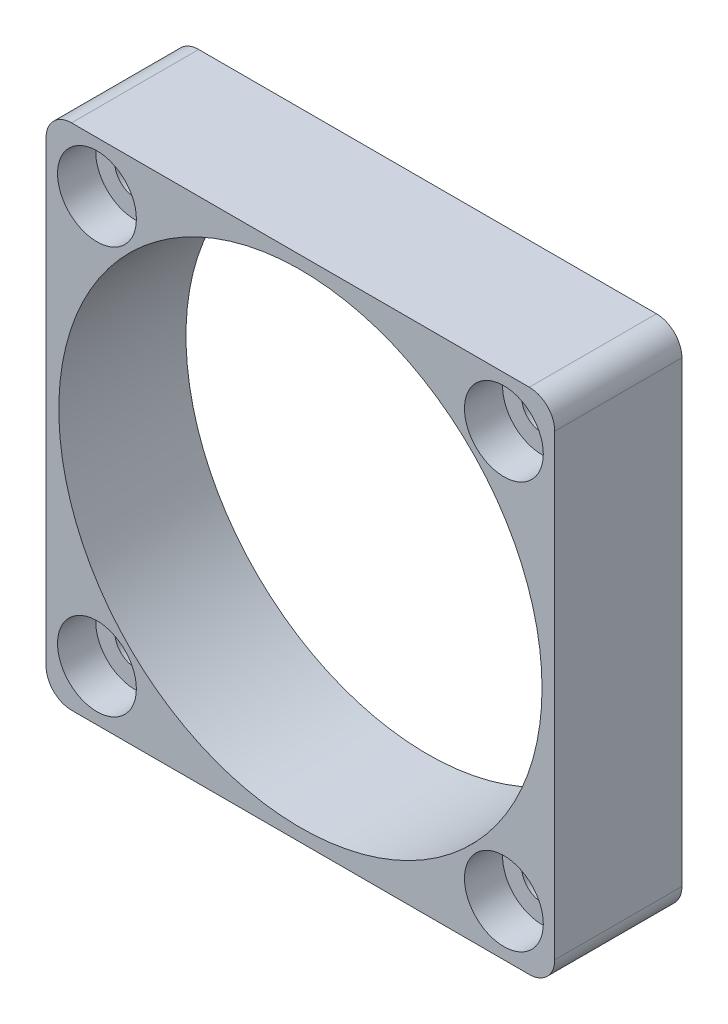
ISO-10303-21;
HEADER;
FILE_DESCRIPTION(('STEP AP214'),'2;1');
FILE_NAME('part.step','',(''),(''),'','','');
FILE_SCHEMA(('AUTOMOTIVE_DESIGN { 1 0 10303 214 1 1 1 1 }'));
ENDSEC;
DATA;
#1=APPLICATION_CONTEXT('core data for automotive mechanical design processes');
#2=APPLICATION_PROTOCOL_DEFINITION('international standard','automotive_design',2000,#1);
#3=PRODUCT_CONTEXT('',#1,'mechanical');
#4=PRODUCT('Part','Part','',(#3));
#5=PRODUCT_RELATED_PRODUCT_CATEGORY('part','',(#4));
#6=PRODUCT_DEFINITION_FORMATION('','',#4);
#7=PRODUCT_DEFINITION_CONTEXT('part definition',#1,'design');
#8=PRODUCT_DEFINITION('design','',#6,#7);
#9=PRODUCT_DEFINITION_SHAPE('','',#8);
#10=(LENGTH_UNIT() NAMED_UNIT(*) SI_UNIT(.MILLI.,.METRE.));
#11=(NAMED_UNIT(*) PLANE_ANGLE_UNIT() SI_UNIT($,.RADIAN.));
#12=(NAMED_UNIT(*) SI_UNIT($,.STERADIAN.) SOLID_ANGLE_UNIT());
#13=UNCERTAINTY_MEASURE_WITH_UNIT(LENGTH_MEASURE(1.E-05),#10,'distance_accuracy_value','');
#14=(GEOMETRIC_REPRESENTATION_CONTEXT(3) GLOBAL_UNCERTAINTY_ASSIGNED_CONTEXT((#13)) GLOBAL_UNIT_ASSIGNED_CONTEXT((#10,
#11,#12)) REPRESENTATION_CONTEXT('',''));
#15=CARTESIAN_POINT('',(0.,0.,0.));
#16=DIRECTION('',(0.,0.,1.));
#17=DIRECTION('',(1.,0.,0.));
#18=AXIS2_PLACEMENT_3D('',#15,#16,#17);
#19=CARTESIAN_POINT('',(-16.,16.,0.));
#20=DIRECTION('',(0.,0.,1.));
#21=DIRECTION('',(1.,0.,0.));
#22=AXIS2_PLACEMENT_3D('',#19,#20,#21);
#23=CYLINDRICAL_SURFACE('',#22,1.6);
#24=CARTESIAN_POINT('',(-16.,16.,0.));
#25=DIRECTION('',(0.,0.,1.));
#26=DIRECTION('',(1.,0.,0.));
#27=AXIS2_PLACEMENT_3D('',#24,#25,#26);
#28=CIRCLE('',#27,1.6);
#29=CARTESIAN_POINT('',(-14.4,16.,0.));
#30=VERTEX_POINT('',#29);
#31=EDGE_CURVE('E200',#30,#30,#28,.T.);
#32=ORIENTED_EDGE('',*,*,#31,.F.);
#33=EDGE_LOOP('',(#32));
#34=FACE_BOUND('',#33,.T.);
#35=CARTESIAN_POINT('',(-16.,16.,7.));
#36=DIRECTION('',(0.,0.,1.));
#37=DIRECTION('',(1.,0.,0.));
#38=AXIS2_PLACEMENT_3D('',#35,#36,#37);
#39=CIRCLE('',#38,1.6);
#40=CARTESIAN_POINT('',(-14.4,16.,7.));
#41=VERTEX_POINT('',#40);
#42=EDGE_CURVE('E38',#41,#41,#39,.F.);
#43=ORIENTED_EDGE('',*,*,#42,.F.);
#44=EDGE_LOOP('',(#43));
#45=FACE_BOUND('',#44,.T.);
#46=ADVANCED_FACE('F34',(#34,#45),#23,.F.);
#47=CARTESIAN_POINT('',(16.,16.,0.));
#48=DIRECTION('',(0.,0.,1.));
#49=DIRECTION('',(1.,0.,0.));
#50=AXIS2_PLACEMENT_3D('',#47,#48,#49);
#51=CYLINDRICAL_SURFACE('',#50,1.6);
#52=CARTESIAN_POINT('',(16.,16.,0.));
#53=DIRECTION('',(0.,0.,1.));
#54=DIRECTION('',(1.,0.,0.));
#55=AXIS2_PLACEMENT_3D('',#52,#53,#54);
#56=CIRCLE('',#55,1.6);
#57=CARTESIAN_POINT('',(17.6,16.,0.));
#58=VERTEX_POINT('',#57);
#59=EDGE_CURVE('E197',#58,#58,#56,.T.);
#60=ORIENTED_EDGE('',*,*,#59,.F.);
#61=EDGE_LOOP('',(#60));
#62=FACE_BOUND('',#61,.T.);
#63=CARTESIAN_POINT('',(16.,16.,7.));
#64=DIRECTION('',(0.,0.,1.));
#65=DIRECTION('',(1.,0.,0.));
#66=AXIS2_PLACEMENT_3D('',#63,#64,#65);
#67=CIRCLE('',#66,1.6);
#68=CARTESIAN_POINT('',(17.6,16.,7.));
#69=VERTEX_POINT('',#68);
#70=EDGE_CURVE('E167',#69,#69,#67,.F.);
#71=ORIENTED_EDGE('',*,*,#70,.F.);
#72=EDGE_LOOP('',(#71));
#73=FACE_BOUND('',#72,.T.);
#74=ADVANCED_FACE('F237',(#62,#73),#51,.F.);
#75=CARTESIAN_POINT('',(16.,-16.,0.));
#76=DIRECTION('',(0.,0.,1.));
#77=DIRECTION('',(1.,0.,0.));
#78=AXIS2_PLACEMENT_3D('',#75,#76,#77);
#79=CYLINDRICAL_SURFACE('',#78,1.6);
#80=CARTESIAN_POINT('',(16.,-16.,0.));
#81=DIRECTION('',(0.,0.,1.));
#82=DIRECTION('',(1.,0.,0.));
#83=AXIS2_PLACEMENT_3D('',#80,#81,#82);
#84=CIRCLE('',#83,1.6);
#85=CARTESIAN_POINT('',(17.6,-16.,0.));
#86=VERTEX_POINT('',#85);
#87=EDGE_CURVE('E194',#86,#86,#84,.T.);
#88=ORIENTED_EDGE('',*,*,#87,.F.);
#89=EDGE_LOOP('',(#88));
#90=FACE_BOUND('',#89,.T.);
#91=CARTESIAN_POINT('',(16.,-16.,7.));
#92=DIRECTION('',(0.,0.,1.));
#93=DIRECTION('',(1.,0.,0.));
#94=AXIS2_PLACEMENT_3D('',#91,#92,#93);
#95=CIRCLE('',#94,1.6);
#96=CARTESIAN_POINT('',(17.6,-16.,7.));
#97=VERTEX_POINT('',#96);
#98=EDGE_CURVE('E163',#97,#97,#95,.F.);
#99=ORIENTED_EDGE('',*,*,#98,.F.);
#100=EDGE_LOOP('',(#99));
#101=FACE_BOUND('',#100,.T.);
#102=ADVANCED_FACE('F243',(#90,#101),#79,.F.);
#103=CARTESIAN_POINT('',(-16.,-16.,0.));
#104=DIRECTION('',(0.,0.,1.));
#105=DIRECTION('',(1.,0.,0.));
#106=AXIS2_PLACEMENT_3D('',#103,#104,#105);
#107=CYLINDRICAL_SURFACE('',#106,1.6);
#108=CARTESIAN_POINT('',(-16.,-16.,0.));
#109=DIRECTION('',(0.,0.,1.));
#110=DIRECTION('',(1.,0.,0.));
#111=AXIS2_PLACEMENT_3D('',#108,#109,#110);
#112=CIRCLE('',#111,1.6);
#113=CARTESIAN_POINT('',(-14.4,-16.,0.));
#114=VERTEX_POINT('',#113);
#115=EDGE_CURVE('E161',#114,#114,#112,.T.);
#116=ORIENTED_EDGE('',*,*,#115,.F.);
#117=EDGE_LOOP('',(#116));
#118=FACE_BOUND('',#117,.T.);
#119=CARTESIAN_POINT('',(-16.,-16.,7.));
#120=DIRECTION('',(0.,0.,1.));
#121=DIRECTION('',(1.,0.,0.));
#122=AXIS2_PLACEMENT_3D('',#119,#120,#121);
#123=CIRCLE('',#122,1.6);
#124=CARTESIAN_POINT('',(-14.4,-16.,7.));
#125=VERTEX_POINT('',#124);
#126=EDGE_CURVE('E158',#125,#125,#123,.F.);
#127=ORIENTED_EDGE('',*,*,#126,.F.);
#128=EDGE_LOOP('',(#127));
#129=FACE_BOUND('',#128,.T.);
#130=ADVANCED_FACE('F276',(#118,#129),#107,.F.);
#131=CARTESIAN_POINT('',(20.,20.,10.));
#132=DIRECTION('',(-1.,0.,0.));
#133=DIRECTION('',(0.,0.,1.));
#134=AXIS2_PLACEMENT_3D('',#131,#132,#133);
#135=PLANE('',#134);
#136=DIRECTION('',(0.,1.,0.));
#137=VECTOR('',#136,1.);
#138=CARTESIAN_POINT('',(20.,20.,10.));
#139=LINE('',#138,#137);
#140=CARTESIAN_POINT('',(20.,-18.,10.));
#141=VERTEX_POINT('',#140);
#142=CARTESIAN_POINT('',(20.,18.,10.));
#143=VERTEX_POINT('',#142);
#144=EDGE_CURVE('E130',#141,#143,#139,.T.);
#145=ORIENTED_EDGE('',*,*,#144,.F.);
#146=DIRECTION('',(0.,0.,-1.));
#147=VECTOR('',#146,1.);
#148=CARTESIAN_POINT('',(20.,-18.,10.));
#149=LINE('',#148,#147);
#150=CARTESIAN_POINT('',(20.,-18.,0.));
#151=VERTEX_POINT('',#150);
#152=EDGE_CURVE('E11',#141,#151,#149,.T.);
#153=ORIENTED_EDGE('',*,*,#152,.T.);
#154=DIRECTION('',(0.,1.,0.));
#155=VECTOR('',#154,1.);
#156=CARTESIAN_POINT('',(20.,20.,0.));
#157=LINE('',#156,#155);
#158=CARTESIAN_POINT('',(20.,18.,0.));
#159=VERTEX_POINT('',#158);
#160=EDGE_CURVE('E207',#151,#159,#157,.T.);
#161=ORIENTED_EDGE('',*,*,#160,.T.);
#162=DIRECTION('',(0.,0.,-1.));
#163=VECTOR('',#162,1.);
#164=CARTESIAN_POINT('',(20.,18.,10.));
#165=LINE('',#164,#163);
#166=EDGE_CURVE('E43',#159,#143,#165,.F.);
#167=ORIENTED_EDGE('',*,*,#166,.T.);
#168=EDGE_LOOP('',(#145,#153,#161,#167));
#169=FACE_BOUND('',#168,.T.);
#170=ADVANCED_FACE('F234',(#169),#135,.F.);
#171=CARTESIAN_POINT('',(-20.,20.,10.));
#172=DIRECTION('',(0.,-1.,0.));
#173=DIRECTION('',(0.,0.,-1.));
#174=AXIS2_PLACEMENT_3D('',#171,#172,#173);
#175=PLANE('',#174);
#176=DIRECTION('',(-1.,0.,0.));
#177=VECTOR('',#176,1.);
#178=CARTESIAN_POINT('',(-20.,20.,0.));
#179=LINE('',#178,#177);
#180=CARTESIAN_POINT('',(18.,20.,0.));
#181=VERTEX_POINT('',#180);
#182=CARTESIAN_POINT('',(-18.,20.,0.));
#183=VERTEX_POINT('',#182);
#184=EDGE_CURVE('E135',#181,#183,#179,.T.);
#185=ORIENTED_EDGE('',*,*,#184,.T.);
#186=DIRECTION('',(0.,0.,-1.));
#187=VECTOR('',#186,1.);
#188=CARTESIAN_POINT('',(-18.,20.,10.));
#189=LINE('',#188,#187);
#190=CARTESIAN_POINT('',(-18.,20.,10.));
#191=VERTEX_POINT('',#190);
#192=EDGE_CURVE('E51',#183,#191,#189,.F.);
#193=ORIENTED_EDGE('',*,*,#192,.T.);
#194=DIRECTION('',(-1.,0.,0.));
#195=VECTOR('',#194,1.);
#196=CARTESIAN_POINT('',(-20.,20.,10.));
#197=LINE('',#196,#195);
#198=CARTESIAN_POINT('',(18.,20.,10.));
#199=VERTEX_POINT('',#198);
#200=EDGE_CURVE('E133',#199,#191,#197,.T.);
#201=ORIENTED_EDGE('',*,*,#200,.F.);
#202=DIRECTION('',(0.,0.,-1.));
#203=VECTOR('',#202,1.);
#204=CARTESIAN_POINT('',(18.,20.,10.));
#205=LINE('',#204,#203);
#206=EDGE_CURVE('E153',#199,#181,#205,.T.);
#207=ORIENTED_EDGE('',*,*,#206,.T.);
#208=EDGE_LOOP('',(#185,#193,#201,#207));
#209=FACE_BOUND('',#208,.T.);
#210=ADVANCED_FACE('F217',(#209),#175,.F.);
#211=CARTESIAN_POINT('',(-20.,20.,10.));
#212=DIRECTION('',(1.,0.,0.));
#213=DIRECTION('',(0.,1.,0.));
#214=AXIS2_PLACEMENT_3D('',#211,#212,#213);
#215=PLANE('',#214);
#216=DIRECTION('',(0.,-1.,0.));
#217=VECTOR('',#216,1.);
#218=CARTESIAN_POINT('',(-20.,20.,0.));
#219=LINE('',#218,#217);
#220=CARTESIAN_POINT('',(-20.,18.,0.));
#221=VERTEX_POINT('',#220);
#222=CARTESIAN_POINT('',(-20.,-18.,0.));
#223=VERTEX_POINT('',#222);
#224=EDGE_CURVE('E131',#221,#223,#219,.T.);
#225=ORIENTED_EDGE('',*,*,#224,.T.);
#226=DIRECTION('',(0.,0.,-1.));
#227=VECTOR('',#226,1.);
#228=CARTESIAN_POINT('',(-20.,-18.,10.));
#229=LINE('',#228,#227);
#230=CARTESIAN_POINT('',(-20.,-18.,10.));
#231=VERTEX_POINT('',#230);
#232=EDGE_CURVE('E108',#223,#231,#229,.F.);
#233=ORIENTED_EDGE('',*,*,#232,.T.);
#234=DIRECTION('',(0.,-1.,0.));
#235=VECTOR('',#234,1.);
#236=CARTESIAN_POINT('',(-20.,20.,10.));
#237=LINE('',#236,#235);
#238=CARTESIAN_POINT('',(-20.,18.,10.));
#239=VERTEX_POINT('',#238);
#240=EDGE_CURVE('E211',#239,#231,#237,.T.);
#241=ORIENTED_EDGE('',*,*,#240,.F.);
#242=DIRECTION('',(0.,0.,-1.));
#243=VECTOR('',#242,1.);
#244=CARTESIAN_POINT('',(-20.,18.,10.));
#245=LINE('',#244,#243);
#246=EDGE_CURVE('E113',#239,#221,#245,.T.);
#247=ORIENTED_EDGE('',*,*,#246,.T.);
#248=EDGE_LOOP('',(#225,#233,#241,#247));
#249=FACE_BOUND('',#248,.T.);
#250=ADVANCED_FACE('F226',(#249),#215,.F.);
#251=CARTESIAN_POINT('',(-20.,-20.,10.));
#252=DIRECTION('',(0.,1.,0.));
#253=DIRECTION('',(0.,0.,1.));
#254=AXIS2_PLACEMENT_3D('',#251,#252,#253);
#255=PLANE('',#254);
#256=DIRECTION('',(1.,0.,0.));
#257=VECTOR('',#256,1.);
#258=CARTESIAN_POINT('',(-20.,-20.,10.));
#259=LINE('',#258,#257);
#260=CARTESIAN_POINT('',(-18.,-20.,10.));
#261=VERTEX_POINT('',#260);
#262=CARTESIAN_POINT('',(18.,-20.,10.));
#263=VERTEX_POINT('',#262);
#264=EDGE_CURVE('E123',#261,#263,#259,.T.);
#265=ORIENTED_EDGE('',*,*,#264,.F.);
#266=DIRECTION('',(0.,0.,-1.));
#267=VECTOR('',#266,1.);
#268=CARTESIAN_POINT('',(-18.,-20.,10.));
#269=LINE('',#268,#267);
#270=CARTESIAN_POINT('',(-18.,-20.,0.));
#271=VERTEX_POINT('',#270);
#272=EDGE_CURVE('E107',#261,#271,#269,.T.);
#273=ORIENTED_EDGE('',*,*,#272,.T.);
#274=DIRECTION('',(1.,0.,0.));
#275=VECTOR('',#274,1.);
#276=CARTESIAN_POINT('',(-20.,-20.,0.));
#277=LINE('',#276,#275);
#278=CARTESIAN_POINT('',(18.,-20.,0.));
#279=VERTEX_POINT('',#278);
#280=EDGE_CURVE('E120',#271,#279,#277,.T.);
#281=ORIENTED_EDGE('',*,*,#280,.T.);
#282=DIRECTION('',(0.,0.,-1.));
#283=VECTOR('',#282,1.);
#284=CARTESIAN_POINT('',(18.,-20.,10.));
#285=LINE('',#284,#283);
#286=EDGE_CURVE('E125',#279,#263,#285,.F.);
#287=ORIENTED_EDGE('',*,*,#286,.T.);
#288=EDGE_LOOP('',(#265,#273,#281,#287));
#289=FACE_BOUND('',#288,.T.);
#290=ADVANCED_FACE('F119',(#289),#255,.F.);
#291=CARTESIAN_POINT('',(0.,0.,10.));
#292=DIRECTION('',(0.,0.,1.));
#293=DIRECTION('',(1.,0.,0.));
#294=AXIS2_PLACEMENT_3D('',#291,#292,#293);
#295=PLANE('',#294);
#296=CARTESIAN_POINT('',(-16.,16.,10.));
#297=DIRECTION('',(0.,0.,1.));
#298=DIRECTION('',(1.,0.,0.));
#299=AXIS2_PLACEMENT_3D('',#296,#297,#298);
#300=CIRCLE('',#299,3.1);
#301=CARTESIAN_POINT('',(-12.9,16.,10.));
#302=VERTEX_POINT('',#301);
#303=EDGE_CURVE('E183',#302,#302,#300,.T.);
#304=ORIENTED_EDGE('',*,*,#303,.F.);
#305=EDGE_LOOP('',(#304));
#306=FACE_BOUND('',#305,.T.);
#307=CARTESIAN_POINT('',(16.,16.,10.));
#308=DIRECTION('',(0.,0.,1.));
#309=DIRECTION('',(1.,0.,0.));
#310=AXIS2_PLACEMENT_3D('',#307,#308,#309);
#311=CIRCLE('',#310,3.1);
#312=CARTESIAN_POINT('',(19.1,16.,10.));
#313=VERTEX_POINT('',#312);
#314=EDGE_CURVE('E176',#313,#313,#311,.T.);
#315=ORIENTED_EDGE('',*,*,#314,.F.);
#316=EDGE_LOOP('',(#315));
#317=FACE_BOUND('',#316,.T.);
#318=CARTESIAN_POINT('',(16.,-16.,10.));
#319=DIRECTION('',(0.,0.,1.));
#320=DIRECTION('',(1.,0.,0.));
#321=AXIS2_PLACEMENT_3D('',#318,#319,#320);
#322=CIRCLE('',#321,3.1);
#323=CARTESIAN_POINT('',(19.1,-16.,10.));
#324=VERTEX_POINT('',#323);
#325=EDGE_CURVE('E169',#324,#324,#322,.T.);
#326=ORIENTED_EDGE('',*,*,#325,.F.);
#327=EDGE_LOOP('',(#326));
#328=FACE_BOUND('',#327,.T.);
#329=CARTESIAN_POINT('',(-16.,-16.,10.));
#330=DIRECTION('',(0.,0.,1.));
#331=DIRECTION('',(1.,0.,0.));
#332=AXIS2_PLACEMENT_3D('',#329,#330,#331);
#333=CIRCLE('',#332,3.1);
#334=CARTESIAN_POINT('',(-12.9,-16.,10.));
#335=VERTEX_POINT('',#334);
#336=EDGE_CURVE('E165',#335,#335,#333,.T.);
#337=ORIENTED_EDGE('',*,*,#336,.F.);
#338=EDGE_LOOP('',(#337));
#339=FACE_BOUND('',#338,.T.);
#340=CARTESIAN_POINT('',(0.,0.,10.));
#341=DIRECTION('',(0.,0.,1.));
#342=DIRECTION('',(1.,0.,0.));
#343=AXIS2_PLACEMENT_3D('',#340,#341,#342);
#344=CIRCLE('',#343,19.);
#345=CARTESIAN_POINT('',(19.,0.,10.));
#346=VERTEX_POINT('',#345);
#347=EDGE_CURVE('E203',#346,#346,#344,.T.);
#348=ORIENTED_EDGE('',*,*,#347,.F.);
#349=EDGE_LOOP('',(#348));
#350=FACE_BOUND('',#349,.T.);
#351=ORIENTED_EDGE('',*,*,#240,.T.);
#352=CARTESIAN_POINT('',(-18.,-18.,10.));
#353=DIRECTION('',(0.,0.,1.));
#354=DIRECTION('',(1.,0.,0.));
#355=AXIS2_PLACEMENT_3D('',#352,#353,#354);
#356=CIRCLE('',#355,2.);
#357=EDGE_CURVE('E151',#231,#261,#356,.T.);
#358=ORIENTED_EDGE('',*,*,#357,.T.);
#359=ORIENTED_EDGE('',*,*,#264,.T.);
#360=CARTESIAN_POINT('',(18.,-18.,10.));
#361=DIRECTION('',(0.,0.,1.));
#362=DIRECTION('',(1.,0.,0.));
#363=AXIS2_PLACEMENT_3D('',#360,#361,#362);
#364=CIRCLE('',#363,2.);
#365=EDGE_CURVE('E147',#263,#141,#364,.T.);
#366=ORIENTED_EDGE('',*,*,#365,.T.);
#367=ORIENTED_EDGE('',*,*,#144,.T.);
#368=CARTESIAN_POINT('',(18.,18.,10.));
#369=DIRECTION('',(0.,0.,1.));
#370=DIRECTION('',(1.,0.,0.));
#371=AXIS2_PLACEMENT_3D('',#368,#369,#370);
#372=CIRCLE('',#371,2.);
#373=EDGE_CURVE('E58',#143,#199,#372,.T.);
#374=ORIENTED_EDGE('',*,*,#373,.T.);
#375=ORIENTED_EDGE('',*,*,#200,.T.);
#376=CARTESIAN_POINT('',(-18.,18.,10.));
#377=DIRECTION('',(0.,0.,1.));
#378=DIRECTION('',(1.,0.,0.));
#379=AXIS2_PLACEMENT_3D('',#376,#377,#378);
#380=CIRCLE('',#379,2.);
#381=EDGE_CURVE('E149',#191,#239,#380,.T.);
#382=ORIENTED_EDGE('',*,*,#381,.T.);
#383=EDGE_LOOP('',(#351,#358,#359,#366,#367,#374,#375,#382));
#384=FACE_BOUND('',#383,.T.);
#385=ADVANCED_FACE('F224',(#306,#317,#328,#339,#350,#384),#295,.T.);
#386=CARTESIAN_POINT('',(0.,0.,0.));
#387=DIRECTION('',(0.,0.,1.));
#388=DIRECTION('',(1.,0.,0.));
#389=AXIS2_PLACEMENT_3D('',#386,#387,#388);
#390=PLANE('',#389);
#391=ORIENTED_EDGE('',*,*,#115,.T.);
#392=EDGE_LOOP('',(#391));
#393=FACE_BOUND('',#392,.T.);
#394=ORIENTED_EDGE('',*,*,#87,.T.);
#395=EDGE_LOOP('',(#394));
#396=FACE_BOUND('',#395,.T.);
#397=ORIENTED_EDGE('',*,*,#59,.T.);
#398=EDGE_LOOP('',(#397));
#399=FACE_BOUND('',#398,.T.);
#400=ORIENTED_EDGE('',*,*,#31,.T.);
#401=EDGE_LOOP('',(#400));
#402=FACE_BOUND('',#401,.T.);
#403=CARTESIAN_POINT('',(0.,0.,0.));
#404=DIRECTION('',(0.,0.,1.));
#405=DIRECTION('',(1.,0.,0.));
#406=AXIS2_PLACEMENT_3D('',#403,#404,#405);
#407=CIRCLE('',#406,19.);
#408=CARTESIAN_POINT('',(19.,0.,0.));
#409=VERTEX_POINT('',#408);
#410=EDGE_CURVE('E204',#409,#409,#407,.T.);
#411=ORIENTED_EDGE('',*,*,#410,.T.);
#412=EDGE_LOOP('',(#411));
#413=FACE_BOUND('',#412,.T.);
#414=ORIENTED_EDGE('',*,*,#280,.F.);
#415=CARTESIAN_POINT('',(-18.,-18.,0.));
#416=DIRECTION('',(0.,0.,1.));
#417=DIRECTION('',(1.,0.,0.));
#418=AXIS2_PLACEMENT_3D('',#415,#416,#417);
#419=CIRCLE('',#418,2.);
#420=EDGE_CURVE('E103',#271,#223,#419,.F.);
#421=ORIENTED_EDGE('',*,*,#420,.T.);
#422=ORIENTED_EDGE('',*,*,#224,.F.);
#423=CARTESIAN_POINT('',(-18.,18.,0.));
#424=DIRECTION('',(0.,0.,1.));
#425=DIRECTION('',(1.,0.,0.));
#426=AXIS2_PLACEMENT_3D('',#423,#424,#425);
#427=CIRCLE('',#426,2.);
#428=EDGE_CURVE('E114',#221,#183,#427,.F.);
#429=ORIENTED_EDGE('',*,*,#428,.T.);
#430=ORIENTED_EDGE('',*,*,#184,.F.);
#431=CARTESIAN_POINT('',(18.,18.,0.));
#432=DIRECTION('',(0.,0.,1.));
#433=DIRECTION('',(1.,0.,0.));
#434=AXIS2_PLACEMENT_3D('',#431,#432,#433);
#435=CIRCLE('',#434,2.);
#436=EDGE_CURVE('E124',#181,#159,#435,.F.);
#437=ORIENTED_EDGE('',*,*,#436,.T.);
#438=ORIENTED_EDGE('',*,*,#160,.F.);
#439=CARTESIAN_POINT('',(18.,-18.,0.));
#440=DIRECTION('',(0.,0.,1.));
#441=DIRECTION('',(1.,0.,0.));
#442=AXIS2_PLACEMENT_3D('',#439,#440,#441);
#443=CIRCLE('',#442,2.);
#444=EDGE_CURVE('E129',#151,#279,#443,.F.);
#445=ORIENTED_EDGE('',*,*,#444,.T.);
#446=EDGE_LOOP('',(#414,#421,#422,#429,#430,#437,#438,#445));
#447=FACE_BOUND('',#446,.T.);
#448=ADVANCED_FACE('F127',(#393,#396,#399,#402,#413,#447),#390,.F.);
#449=CARTESIAN_POINT('',(0.,0.,0.));
#450=DIRECTION('',(0.,0.,1.));
#451=DIRECTION('',(1.,0.,0.));
#452=AXIS2_PLACEMENT_3D('',#449,#450,#451);
#453=CYLINDRICAL_SURFACE('',#452,19.);
#454=ORIENTED_EDGE('',*,*,#410,.F.);
#455=EDGE_LOOP('',(#454));
#456=FACE_BOUND('',#455,.T.);
#457=ORIENTED_EDGE('',*,*,#347,.T.);
#458=EDGE_LOOP('',(#457));
#459=FACE_BOUND('',#458,.T.);
#460=ADVANCED_FACE('F250',(#456,#459),#453,.F.);
#461=CARTESIAN_POINT('',(-18.,-18.,10.));
#462=DIRECTION('',(0.,0.,-1.));
#463=DIRECTION('',(-1.,0.,0.));
#464=AXIS2_PLACEMENT_3D('',#461,#462,#463);
#465=CYLINDRICAL_SURFACE('',#464,2.);
#466=ORIENTED_EDGE('',*,*,#357,.F.);
#467=ORIENTED_EDGE('',*,*,#232,.F.);
#468=ORIENTED_EDGE('',*,*,#420,.F.);
#469=ORIENTED_EDGE('',*,*,#272,.F.);
#470=EDGE_LOOP('',(#466,#467,#468,#469));
#471=FACE_BOUND('',#470,.T.);
#472=ADVANCED_FACE('F106',(#471),#465,.T.);
#473=CARTESIAN_POINT('',(-18.,18.,10.));
#474=DIRECTION('',(0.,0.,-1.));
#475=DIRECTION('',(-1.,0.,0.));
#476=AXIS2_PLACEMENT_3D('',#473,#474,#475);
#477=CYLINDRICAL_SURFACE('',#476,2.);
#478=ORIENTED_EDGE('',*,*,#381,.F.);
#479=ORIENTED_EDGE('',*,*,#192,.F.);
#480=ORIENTED_EDGE('',*,*,#428,.F.);
#481=ORIENTED_EDGE('',*,*,#246,.F.);
#482=EDGE_LOOP('',(#478,#479,#480,#481));
#483=FACE_BOUND('',#482,.T.);
#484=ADVANCED_FACE('F221',(#483),#477,.T.);
#485=CARTESIAN_POINT('',(18.,-18.,10.));
#486=DIRECTION('',(0.,0.,-1.));
#487=DIRECTION('',(-1.,0.,0.));
#488=AXIS2_PLACEMENT_3D('',#485,#486,#487);
#489=CYLINDRICAL_SURFACE('',#488,2.);
#490=ORIENTED_EDGE('',*,*,#365,.F.);
#491=ORIENTED_EDGE('',*,*,#286,.F.);
#492=ORIENTED_EDGE('',*,*,#444,.F.);
#493=ORIENTED_EDGE('',*,*,#152,.F.);
#494=EDGE_LOOP('',(#490,#491,#492,#493));
#495=FACE_BOUND('',#494,.T.);
#496=ADVANCED_FACE('F319',(#495),#489,.T.);
#497=CARTESIAN_POINT('',(18.,18.,10.));
#498=DIRECTION('',(0.,0.,-1.));
#499=DIRECTION('',(-1.,0.,0.));
#500=AXIS2_PLACEMENT_3D('',#497,#498,#499);
#501=CYLINDRICAL_SURFACE('',#500,2.);
#502=ORIENTED_EDGE('',*,*,#373,.F.);
#503=ORIENTED_EDGE('',*,*,#166,.F.);
#504=ORIENTED_EDGE('',*,*,#436,.F.);
#505=ORIENTED_EDGE('',*,*,#206,.F.);
#506=EDGE_LOOP('',(#502,#503,#504,#505));
#507=FACE_BOUND('',#506,.T.);
#508=ADVANCED_FACE('F36',(#507),#501,.T.);
#509=CARTESIAN_POINT('',(-16.,-16.,7.));
#510=DIRECTION('',(0.,0.,1.));
#511=DIRECTION('',(1.,0.,0.));
#512=AXIS2_PLACEMENT_3D('',#509,#510,#511);
#513=PLANE('',#512);
#514=CARTESIAN_POINT('',(-16.,-16.,7.));
#515=DIRECTION('',(0.,0.,1.));
#516=DIRECTION('',(1.,0.,0.));
#517=AXIS2_PLACEMENT_3D('',#514,#515,#516);
#518=CIRCLE('',#517,3.1);
#519=CARTESIAN_POINT('',(-12.9,-16.,7.));
#520=VERTEX_POINT('',#519);
#521=EDGE_CURVE('E162',#520,#520,#518,.T.);
#522=ORIENTED_EDGE('',*,*,#521,.T.);
#523=EDGE_LOOP('',(#522));
#524=FACE_BOUND('',#523,.T.);
#525=ORIENTED_EDGE('',*,*,#126,.T.);
#526=EDGE_LOOP('',(#525));
#527=FACE_BOUND('',#526,.T.);
#528=ADVANCED_FACE('F292',(#524,#527),#513,.T.);
#529=CARTESIAN_POINT('',(-16.,-16.,7.));
#530=DIRECTION('',(0.,0.,1.));
#531=DIRECTION('',(1.,0.,0.));
#532=AXIS2_PLACEMENT_3D('',#529,#530,#531);
#533=CYLINDRICAL_SURFACE('',#532,3.1);
#534=ORIENTED_EDGE('',*,*,#521,.F.);
#535=EDGE_LOOP('',(#534));
#536=FACE_BOUND('',#535,.T.);
#537=ORIENTED_EDGE('',*,*,#336,.T.);
#538=EDGE_LOOP('',(#537));
#539=FACE_BOUND('',#538,.T.);
#540=ADVANCED_FACE('F282',(#536,#539),#533,.F.);
#541=CARTESIAN_POINT('',(16.,-16.,7.));
#542=DIRECTION('',(0.,0.,1.));
#543=DIRECTION('',(1.,0.,0.));
#544=AXIS2_PLACEMENT_3D('',#541,#542,#543);
#545=PLANE('',#544);
#546=CARTESIAN_POINT('',(16.,-16.,7.));
#547=DIRECTION('',(0.,0.,1.));
#548=DIRECTION('',(1.,0.,0.));
#549=AXIS2_PLACEMENT_3D('',#546,#547,#548);
#550=CIRCLE('',#549,3.1);
#551=CARTESIAN_POINT('',(19.1,-16.,7.));
#552=VERTEX_POINT('',#551);
#553=EDGE_CURVE('E166',#552,#552,#550,.T.);
#554=ORIENTED_EDGE('',*,*,#553,.T.);
#555=EDGE_LOOP('',(#554));
#556=FACE_BOUND('',#555,.T.);
#557=ORIENTED_EDGE('',*,*,#98,.T.);
#558=EDGE_LOOP('',(#557));
#559=FACE_BOUND('',#558,.T.);
#560=ADVANCED_FACE('F279',(#556,#559),#545,.T.);
#561=CARTESIAN_POINT('',(16.,-16.,7.));
#562=DIRECTION('',(0.,0.,1.));
#563=DIRECTION('',(1.,0.,0.));
#564=AXIS2_PLACEMENT_3D('',#561,#562,#563);
#565=CYLINDRICAL_SURFACE('',#564,3.1);
#566=ORIENTED_EDGE('',*,*,#553,.F.);
#567=EDGE_LOOP('',(#566));
#568=FACE_BOUND('',#567,.T.);
#569=ORIENTED_EDGE('',*,*,#325,.T.);
#570=EDGE_LOOP('',(#569));
#571=FACE_BOUND('',#570,.T.);
#572=ADVANCED_FACE('F281',(#568,#571),#565,.F.);
#573=CARTESIAN_POINT('',(16.,16.,7.));
#574=DIRECTION('',(0.,0.,1.));
#575=DIRECTION('',(1.,0.,0.));
#576=AXIS2_PLACEMENT_3D('',#573,#574,#575);
#577=PLANE('',#576);
#578=CARTESIAN_POINT('',(16.,16.,7.));
#579=DIRECTION('',(0.,0.,1.));
#580=DIRECTION('',(1.,0.,0.));
#581=AXIS2_PLACEMENT_3D('',#578,#579,#580);
#582=CIRCLE('',#581,3.1);
#583=CARTESIAN_POINT('',(19.1,16.,7.));
#584=VERTEX_POINT('',#583);
#585=EDGE_CURVE('E170',#584,#584,#582,.T.);
#586=ORIENTED_EDGE('',*,*,#585,.T.);
#587=EDGE_LOOP('',(#586));
#588=FACE_BOUND('',#587,.T.);
#589=ORIENTED_EDGE('',*,*,#70,.T.);
#590=EDGE_LOOP('',(#589));
#591=FACE_BOUND('',#590,.T.);
#592=ADVANCED_FACE('F289',(#588,#591),#577,.T.);
#593=CARTESIAN_POINT('',(16.,16.,7.));
#594=DIRECTION('',(0.,0.,1.));
#595=DIRECTION('',(1.,0.,0.));
#596=AXIS2_PLACEMENT_3D('',#593,#594,#595);
#597=CYLINDRICAL_SURFACE('',#596,3.1);
#598=ORIENTED_EDGE('',*,*,#585,.F.);
#599=EDGE_LOOP('',(#598));
#600=FACE_BOUND('',#599,.T.);
#601=ORIENTED_EDGE('',*,*,#314,.T.);
#602=EDGE_LOOP('',(#601));
#603=FACE_BOUND('',#602,.T.);
#604=ADVANCED_FACE('F296',(#600,#603),#597,.F.);
#605=CARTESIAN_POINT('',(-16.,16.,7.));
#606=DIRECTION('',(0.,0.,1.));
#607=DIRECTION('',(1.,0.,0.));
#608=AXIS2_PLACEMENT_3D('',#605,#606,#607);
#609=PLANE('',#608);
#610=CARTESIAN_POINT('',(-16.,16.,7.));
#611=DIRECTION('',(0.,0.,1.));
#612=DIRECTION('',(1.,0.,0.));
#613=AXIS2_PLACEMENT_3D('',#610,#611,#612);
#614=CIRCLE('',#613,3.1);
#615=CARTESIAN_POINT('',(-12.9,16.,7.));
#616=VERTEX_POINT('',#615);
#617=EDGE_CURVE('E392',#616,#616,#614,.T.);
#618=ORIENTED_EDGE('',*,*,#617,.T.);
#619=EDGE_LOOP('',(#618));
#620=FACE_BOUND('',#619,.T.);
#621=ORIENTED_EDGE('',*,*,#42,.T.);
#622=EDGE_LOOP('',(#621));
#623=FACE_BOUND('',#622,.T.);
#624=ADVANCED_FACE('F366',(#620,#623),#609,.T.);
#625=CARTESIAN_POINT('',(-16.,16.,7.));
#626=DIRECTION('',(0.,0.,1.));
#627=DIRECTION('',(1.,0.,0.));
#628=AXIS2_PLACEMENT_3D('',#625,#626,#627);
#629=CYLINDRICAL_SURFACE('',#628,3.1);
#630=ORIENTED_EDGE('',*,*,#617,.F.);
#631=EDGE_LOOP('',(#630));
#632=FACE_BOUND('',#631,.T.);
#633=ORIENTED_EDGE('',*,*,#303,.T.);
#634=EDGE_LOOP('',(#633));
#635=FACE_BOUND('',#634,.T.);
#636=ADVANCED_FACE('F375',(#632,#635),#629,.F.);
#637=CLOSED_SHELL('',(#46,#74,#102,#130,#170,#210,#250,#290,#385,#448,#460,#472,#484,#496,#508,
#528,#540,#560,#572,#592,#604,#624,#636));
#638=MANIFOLD_SOLID_BREP('B2',#637);
#639=ADVANCED_BREP_SHAPE_REPRESENTATION('',(#18,#638),#14);
#640=SHAPE_DEFINITION_REPRESENTATION(#9,#639);
ENDSEC;
END-ISO-10303-21;
